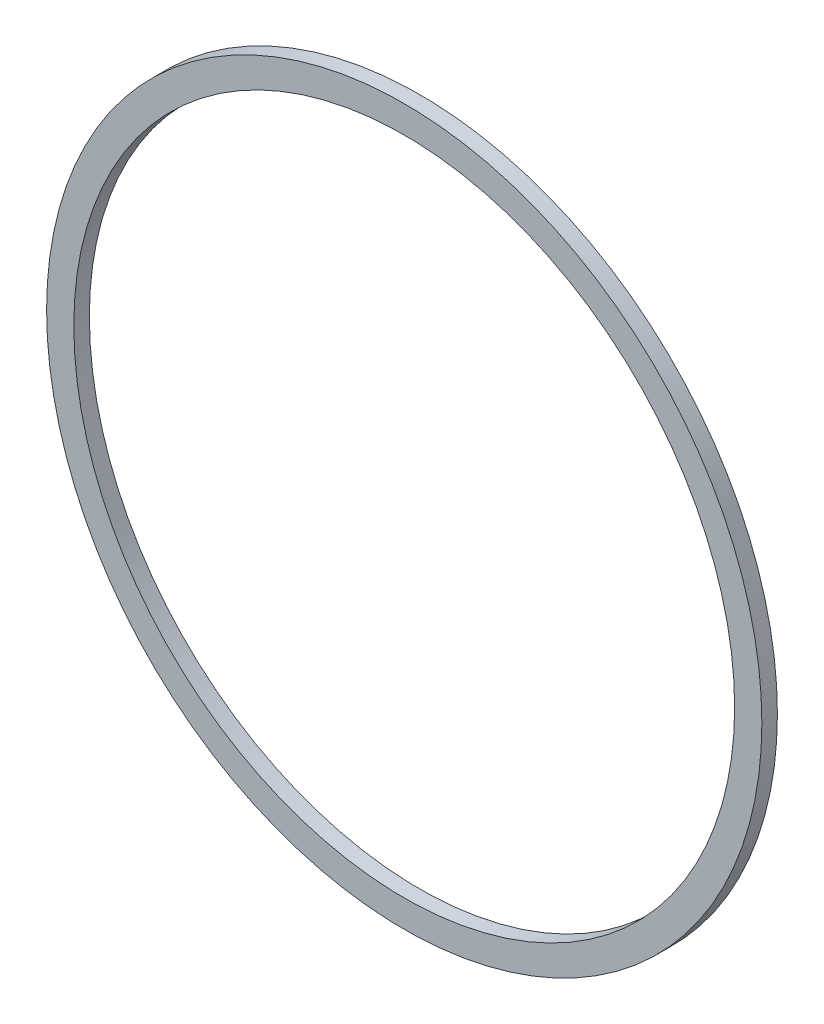
ISO-10303-21;
HEADER;
FILE_DESCRIPTION(('STEP AP214'),'2;1');
FILE_NAME('part.step','',(''),(''),'','','');
FILE_SCHEMA(('AUTOMOTIVE_DESIGN { 1 0 10303 214 1 1 1 1 }'));
ENDSEC;
DATA;
#1=APPLICATION_CONTEXT('core data for automotive mechanical design processes');
#2=APPLICATION_PROTOCOL_DEFINITION('international standard','automotive_design',2000,#1);
#3=PRODUCT_CONTEXT('',#1,'mechanical');
#4=PRODUCT('Part','Part','',(#3));
#5=PRODUCT_RELATED_PRODUCT_CATEGORY('part','',(#4));
#6=PRODUCT_DEFINITION_FORMATION('','',#4);
#7=PRODUCT_DEFINITION_CONTEXT('part definition',#1,'design');
#8=PRODUCT_DEFINITION('design','',#6,#7);
#9=PRODUCT_DEFINITION_SHAPE('','',#8);
#10=(LENGTH_UNIT() NAMED_UNIT(*) SI_UNIT(.MILLI.,.METRE.));
#11=(NAMED_UNIT(*) PLANE_ANGLE_UNIT() SI_UNIT($,.RADIAN.));
#12=(NAMED_UNIT(*) SI_UNIT($,.STERADIAN.) SOLID_ANGLE_UNIT());
#13=UNCERTAINTY_MEASURE_WITH_UNIT(LENGTH_MEASURE(1.E-05),#10,'distance_accuracy_value','');
#14=(GEOMETRIC_REPRESENTATION_CONTEXT(3) GLOBAL_UNCERTAINTY_ASSIGNED_CONTEXT((#13)) GLOBAL_UNIT_ASSIGNED_CONTEXT((#10,
#11,#12)) REPRESENTATION_CONTEXT('',''));
#15=CARTESIAN_POINT('',(0.,0.,0.));
#16=DIRECTION('',(0.,0.,1.));
#17=DIRECTION('',(1.,0.,0.));
#18=AXIS2_PLACEMENT_3D('',#15,#16,#17);
#19=CARTESIAN_POINT('',(0.,0.,-2.));
#20=DIRECTION('',(0.,0.,1.));
#21=DIRECTION('',(1.,0.,0.));
#22=AXIS2_PLACEMENT_3D('',#19,#20,#21);
#23=CYLINDRICAL_SURFACE('',#22,46.);
#24=CARTESIAN_POINT('',(0.,0.,-2.));
#25=DIRECTION('',(0.,0.,1.));
#26=DIRECTION('',(1.,0.,0.));
#27=AXIS2_PLACEMENT_3D('',#24,#25,#26);
#28=CIRCLE('',#27,46.);
#29=CARTESIAN_POINT('',(46.,0.,-2.));
#30=VERTEX_POINT('',#29);
#31=EDGE_CURVE('E10',#30,#30,#28,.T.);
#32=ORIENTED_EDGE('',*,*,#31,.T.);
#33=EDGE_LOOP('',(#32));
#34=FACE_BOUND('',#33,.T.);
#35=CARTESIAN_POINT('',(0.,0.,0.));
#36=DIRECTION('',(0.,0.,1.));
#37=DIRECTION('',(1.,0.,0.));
#38=AXIS2_PLACEMENT_3D('',#35,#36,#37);
#39=CIRCLE('',#38,46.);
#40=CARTESIAN_POINT('',(46.,0.,0.));
#41=VERTEX_POINT('',#40);
#42=EDGE_CURVE('E44',#41,#41,#39,.T.);
#43=ORIENTED_EDGE('',*,*,#42,.F.);
#44=EDGE_LOOP('',(#43));
#45=FACE_BOUND('',#44,.T.);
#46=ADVANCED_FACE('F41',(#34,#45),#23,.T.);
#47=CARTESIAN_POINT('',(0.,0.,-2.));
#48=DIRECTION('',(0.,0.,1.));
#49=DIRECTION('',(1.,0.,0.));
#50=AXIS2_PLACEMENT_3D('',#47,#48,#49);
#51=PLANE('',#50);
#52=CARTESIAN_POINT('',(0.,0.,-2.));
#53=DIRECTION('',(0.,0.,1.));
#54=DIRECTION('',(1.,0.,0.));
#55=AXIS2_PLACEMENT_3D('',#52,#53,#54);
#56=CIRCLE('',#55,42.5);
#57=CARTESIAN_POINT('',(42.5,0.,-2.));
#58=VERTEX_POINT('',#57);
#59=EDGE_CURVE('E53',#58,#58,#56,.T.);
#60=ORIENTED_EDGE('',*,*,#59,.T.);
#61=EDGE_LOOP('',(#60));
#62=FACE_BOUND('',#61,.T.);
#63=ORIENTED_EDGE('',*,*,#31,.F.);
#64=EDGE_LOOP('',(#63));
#65=FACE_BOUND('',#64,.T.);
#66=ADVANCED_FACE('F63',(#62,#65),#51,.F.);
#67=CARTESIAN_POINT('',(0.,0.,0.));
#68=DIRECTION('',(0.,0.,1.));
#69=DIRECTION('',(1.,0.,0.));
#70=AXIS2_PLACEMENT_3D('',#67,#68,#69);
#71=PLANE('',#70);
#72=CARTESIAN_POINT('',(0.,0.,0.));
#73=DIRECTION('',(0.,0.,1.));
#74=DIRECTION('',(1.,0.,0.));
#75=AXIS2_PLACEMENT_3D('',#72,#73,#74);
#76=CIRCLE('',#75,42.5);
#77=CARTESIAN_POINT('',(42.5,0.,0.));
#78=VERTEX_POINT('',#77);
#79=EDGE_CURVE('E55',#78,#78,#76,.T.);
#80=ORIENTED_EDGE('',*,*,#79,.F.);
#81=EDGE_LOOP('',(#80));
#82=FACE_BOUND('',#81,.T.);
#83=ORIENTED_EDGE('',*,*,#42,.T.);
#84=EDGE_LOOP('',(#83));
#85=FACE_BOUND('',#84,.T.);
#86=ADVANCED_FACE('F69',(#82,#85),#71,.T.);
#87=CARTESIAN_POINT('',(0.,0.,-2.));
#88=DIRECTION('',(0.,0.,1.));
#89=DIRECTION('',(1.,0.,0.));
#90=AXIS2_PLACEMENT_3D('',#87,#88,#89);
#91=CYLINDRICAL_SURFACE('',#90,42.5);
#92=ORIENTED_EDGE('',*,*,#59,.F.);
#93=EDGE_LOOP('',(#92));
#94=FACE_BOUND('',#93,.T.);
#95=ORIENTED_EDGE('',*,*,#79,.T.);
#96=EDGE_LOOP('',(#95));
#97=FACE_BOUND('',#96,.T.);
#98=ADVANCED_FACE('F66',(#94,#97),#91,.F.);
#99=CLOSED_SHELL('',(#46,#66,#86,#98));
#100=MANIFOLD_SOLID_BREP('B2',#99);
#101=ADVANCED_BREP_SHAPE_REPRESENTATION('',(#18,#100),#14);
#102=SHAPE_DEFINITION_REPRESENTATION(#9,#101);
ENDSEC;
END-ISO-10303-21;
